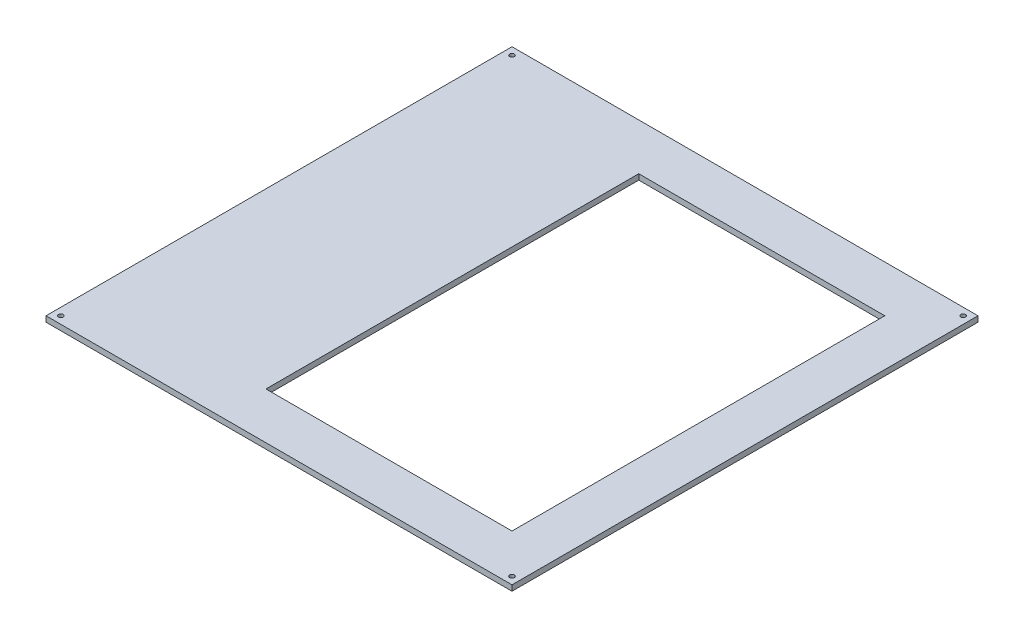
ISO-10303-21;
HEADER;
FILE_DESCRIPTION(('STEP AP214'),'2;1');
FILE_NAME('part.step','',(''),(''),'','','');
FILE_SCHEMA(('AUTOMOTIVE_DESIGN { 1 0 10303 214 1 1 1 1 }'));
ENDSEC;
DATA;
#1=APPLICATION_CONTEXT('core data for automotive mechanical design processes');
#2=APPLICATION_PROTOCOL_DEFINITION('international standard','automotive_design',2000,#1);
#3=PRODUCT_CONTEXT('',#1,'mechanical');
#4=PRODUCT('Part','Part','',(#3));
#5=PRODUCT_RELATED_PRODUCT_CATEGORY('part','',(#4));
#6=PRODUCT_DEFINITION_FORMATION('','',#4);
#7=PRODUCT_DEFINITION_CONTEXT('part definition',#1,'design');
#8=PRODUCT_DEFINITION('design','',#6,#7);
#9=PRODUCT_DEFINITION_SHAPE('','',#8);
#10=(LENGTH_UNIT() NAMED_UNIT(*) SI_UNIT(.MILLI.,.METRE.));
#11=(NAMED_UNIT(*) PLANE_ANGLE_UNIT() SI_UNIT($,.RADIAN.));
#12=(NAMED_UNIT(*) SI_UNIT($,.STERADIAN.) SOLID_ANGLE_UNIT());
#13=UNCERTAINTY_MEASURE_WITH_UNIT(LENGTH_MEASURE(1.E-05),#10,'distance_accuracy_value','');
#14=(GEOMETRIC_REPRESENTATION_CONTEXT(3) GLOBAL_UNCERTAINTY_ASSIGNED_CONTEXT((#13)) GLOBAL_UNIT_ASSIGNED_CONTEXT((#10,
#11,#12)) REPRESENTATION_CONTEXT('',''));
#15=CARTESIAN_POINT('',(0.,0.,0.));
#16=DIRECTION('',(0.,0.,1.));
#17=DIRECTION('',(1.,0.,0.));
#18=AXIS2_PLACEMENT_3D('',#15,#16,#17);
#19=CARTESIAN_POINT('',(125.,3.,125.));
#20=DIRECTION('',(-1.,0.,0.));
#21=DIRECTION('',(0.,0.,1.));
#22=AXIS2_PLACEMENT_3D('',#19,#20,#21);
#23=PLANE('',#22);
#24=DIRECTION('',(0.,0.,-1.));
#25=VECTOR('',#24,1.);
#26=CARTESIAN_POINT('',(125.,0.,125.));
#27=LINE('',#26,#25);
#28=CARTESIAN_POINT('',(125.,0.,125.));
#29=VERTEX_POINT('',#28);
#30=CARTESIAN_POINT('',(125.,0.,-125.));
#31=VERTEX_POINT('',#30);
#32=EDGE_CURVE('E145',#29,#31,#27,.T.);
#33=ORIENTED_EDGE('',*,*,#32,.T.);
#34=DIRECTION('',(0.,-1.,0.));
#35=VECTOR('',#34,1.);
#36=CARTESIAN_POINT('',(125.,3.,-125.));
#37=LINE('',#36,#35);
#38=CARTESIAN_POINT('',(125.,3.,-125.));
#39=VERTEX_POINT('',#38);
#40=EDGE_CURVE('E11',#39,#31,#37,.T.);
#41=ORIENTED_EDGE('',*,*,#40,.F.);
#42=DIRECTION('',(0.,0.,-1.));
#43=VECTOR('',#42,1.);
#44=CARTESIAN_POINT('',(125.,3.,125.));
#45=LINE('',#44,#43);
#46=CARTESIAN_POINT('',(125.,3.,125.));
#47=VERTEX_POINT('',#46);
#48=EDGE_CURVE('E141',#47,#39,#45,.T.);
#49=ORIENTED_EDGE('',*,*,#48,.F.);
#50=DIRECTION('',(0.,-1.,0.));
#51=VECTOR('',#50,1.);
#52=CARTESIAN_POINT('',(125.,3.,125.));
#53=LINE('',#52,#51);
#54=EDGE_CURVE('E155',#47,#29,#53,.T.);
#55=ORIENTED_EDGE('',*,*,#54,.T.);
#56=EDGE_LOOP('',(#33,#41,#49,#55));
#57=FACE_BOUND('',#56,.T.);
#58=ADVANCED_FACE('F41',(#57),#23,.F.);
#59=CARTESIAN_POINT('',(-125.,3.,-125.));
#60=DIRECTION('',(0.,0.,1.));
#61=DIRECTION('',(1.,0.,0.));
#62=AXIS2_PLACEMENT_3D('',#59,#60,#61);
#63=PLANE('',#62);
#64=DIRECTION('',(-1.,0.,0.));
#65=VECTOR('',#64,1.);
#66=CARTESIAN_POINT('',(-125.,0.,-125.));
#67=LINE('',#66,#65);
#68=CARTESIAN_POINT('',(-125.,0.,-125.));
#69=VERTEX_POINT('',#68);
#70=EDGE_CURVE('E156',#31,#69,#67,.T.);
#71=ORIENTED_EDGE('',*,*,#70,.T.);
#72=DIRECTION('',(0.,-1.,0.));
#73=VECTOR('',#72,1.);
#74=CARTESIAN_POINT('',(-125.,3.,-125.));
#75=LINE('',#74,#73);
#76=CARTESIAN_POINT('',(-125.,3.,-125.));
#77=VERTEX_POINT('',#76);
#78=EDGE_CURVE('E48',#77,#69,#75,.T.);
#79=ORIENTED_EDGE('',*,*,#78,.F.);
#80=DIRECTION('',(-1.,0.,0.));
#81=VECTOR('',#80,1.);
#82=CARTESIAN_POINT('',(-125.,3.,-125.));
#83=LINE('',#82,#81);
#84=EDGE_CURVE('E147',#39,#77,#83,.T.);
#85=ORIENTED_EDGE('',*,*,#84,.F.);
#86=ORIENTED_EDGE('',*,*,#40,.T.);
#87=EDGE_LOOP('',(#71,#79,#85,#86));
#88=FACE_BOUND('',#87,.T.);
#89=ADVANCED_FACE('F183',(#88),#63,.F.);
#90=CARTESIAN_POINT('',(-125.,3.,125.));
#91=DIRECTION('',(1.,0.,0.));
#92=DIRECTION('',(0.,0.,-1.));
#93=AXIS2_PLACEMENT_3D('',#90,#91,#92);
#94=PLANE('',#93);
#95=DIRECTION('',(0.,0.,1.));
#96=VECTOR('',#95,1.);
#97=CARTESIAN_POINT('',(-125.,0.,125.));
#98=LINE('',#97,#96);
#99=CARTESIAN_POINT('',(-125.,0.,125.));
#100=VERTEX_POINT('',#99);
#101=EDGE_CURVE('E158',#69,#100,#98,.T.);
#102=ORIENTED_EDGE('',*,*,#101,.T.);
#103=DIRECTION('',(0.,-1.,0.));
#104=VECTOR('',#103,1.);
#105=CARTESIAN_POINT('',(-125.,3.,125.));
#106=LINE('',#105,#104);
#107=CARTESIAN_POINT('',(-125.,3.,125.));
#108=VERTEX_POINT('',#107);
#109=EDGE_CURVE('E161',#108,#100,#106,.T.);
#110=ORIENTED_EDGE('',*,*,#109,.F.);
#111=DIRECTION('',(0.,0.,1.));
#112=VECTOR('',#111,1.);
#113=CARTESIAN_POINT('',(-125.,3.,125.));
#114=LINE('',#113,#112);
#115=EDGE_CURVE('E146',#77,#108,#114,.T.);
#116=ORIENTED_EDGE('',*,*,#115,.F.);
#117=ORIENTED_EDGE('',*,*,#78,.T.);
#118=EDGE_LOOP('',(#102,#110,#116,#117));
#119=FACE_BOUND('',#118,.T.);
#120=ADVANCED_FACE('F167',(#119),#94,.F.);
#121=CARTESIAN_POINT('',(-125.,3.,125.));
#122=DIRECTION('',(0.,0.,-1.));
#123=DIRECTION('',(-1.,0.,0.));
#124=AXIS2_PLACEMENT_3D('',#121,#122,#123);
#125=PLANE('',#124);
#126=DIRECTION('',(1.,0.,0.));
#127=VECTOR('',#126,1.);
#128=CARTESIAN_POINT('',(-125.,0.,125.));
#129=LINE('',#128,#127);
#130=EDGE_CURVE('E150',#100,#29,#129,.T.);
#131=ORIENTED_EDGE('',*,*,#130,.T.);
#132=ORIENTED_EDGE('',*,*,#54,.F.);
#133=DIRECTION('',(1.,0.,0.));
#134=VECTOR('',#133,1.);
#135=CARTESIAN_POINT('',(-125.,3.,125.));
#136=LINE('',#135,#134);
#137=EDGE_CURVE('E152',#108,#47,#136,.T.);
#138=ORIENTED_EDGE('',*,*,#137,.F.);
#139=ORIENTED_EDGE('',*,*,#109,.T.);
#140=EDGE_LOOP('',(#131,#132,#138,#139));
#141=FACE_BOUND('',#140,.T.);
#142=ADVANCED_FACE('F180',(#141),#125,.F.);
#143=CARTESIAN_POINT('',(0.,3.,0.));
#144=DIRECTION('',(0.,-1.,0.));
#145=DIRECTION('',(0.,0.,-1.));
#146=AXIS2_PLACEMENT_3D('',#143,#144,#145);
#147=PLANE('',#146);
#148=CARTESIAN_POINT('',(-121.,3.,-121.));
#149=DIRECTION('',(0.,-1.,0.));
#150=DIRECTION('',(0.,0.,-1.));
#151=AXIS2_PLACEMENT_3D('',#148,#149,#150);
#152=CIRCLE('',#151,1.25);
#153=CARTESIAN_POINT('',(-121.,3.,-122.25));
#154=VERTEX_POINT('',#153);
#155=EDGE_CURVE('E239',#154,#154,#152,.T.);
#156=ORIENTED_EDGE('',*,*,#155,.T.);
#157=EDGE_LOOP('',(#156));
#158=FACE_BOUND('',#157,.T.);
#159=CARTESIAN_POINT('',(121.,3.,-121.));
#160=DIRECTION('',(0.,-1.,0.));
#161=DIRECTION('',(0.,0.,-1.));
#162=AXIS2_PLACEMENT_3D('',#159,#160,#161);
#163=CIRCLE('',#162,1.25);
#164=CARTESIAN_POINT('',(121.,3.,-122.25));
#165=VERTEX_POINT('',#164);
#166=EDGE_CURVE('E236',#165,#165,#163,.T.);
#167=ORIENTED_EDGE('',*,*,#166,.T.);
#168=EDGE_LOOP('',(#167));
#169=FACE_BOUND('',#168,.T.);
#170=CARTESIAN_POINT('',(121.,3.,121.));
#171=DIRECTION('',(0.,-1.,0.));
#172=DIRECTION('',(0.,0.,-1.));
#173=AXIS2_PLACEMENT_3D('',#170,#171,#172);
#174=CIRCLE('',#173,1.25);
#175=CARTESIAN_POINT('',(121.,3.,119.75));
#176=VERTEX_POINT('',#175);
#177=EDGE_CURVE('E234',#176,#176,#174,.T.);
#178=ORIENTED_EDGE('',*,*,#177,.T.);
#179=EDGE_LOOP('',(#178));
#180=FACE_BOUND('',#179,.T.);
#181=CARTESIAN_POINT('',(-121.,3.,121.));
#182=DIRECTION('',(0.,-1.,0.));
#183=DIRECTION('',(0.,0.,-1.));
#184=AXIS2_PLACEMENT_3D('',#181,#182,#183);
#185=CIRCLE('',#184,1.25);
#186=CARTESIAN_POINT('',(-121.,3.,119.75));
#187=VERTEX_POINT('',#186);
#188=EDGE_CURVE('E240',#187,#187,#185,.T.);
#189=ORIENTED_EDGE('',*,*,#188,.T.);
#190=EDGE_LOOP('',(#189));
#191=FACE_BOUND('',#190,.T.);
#192=DIRECTION('',(1.,0.,0.));
#193=VECTOR('',#192,1.);
#194=CARTESIAN_POINT('',(0.,3.,-100.));
#195=LINE('',#194,#193);
#196=CARTESIAN_POINT('',(-32.,3.,-100.));
#197=VERTEX_POINT('',#196);
#198=CARTESIAN_POINT('',(100.,3.,-100.));
#199=VERTEX_POINT('',#198);
#200=EDGE_CURVE('E136',#197,#199,#195,.T.);
#201=ORIENTED_EDGE('',*,*,#200,.T.);
#202=DIRECTION('',(0.,0.,1.));
#203=VECTOR('',#202,1.);
#204=CARTESIAN_POINT('',(100.,3.,0.));
#205=LINE('',#204,#203);
#206=CARTESIAN_POINT('',(100.,3.,100.));
#207=VERTEX_POINT('',#206);
#208=EDGE_CURVE('E137',#199,#207,#205,.T.);
#209=ORIENTED_EDGE('',*,*,#208,.T.);
#210=DIRECTION('',(-1.,0.,0.));
#211=VECTOR('',#210,1.);
#212=CARTESIAN_POINT('',(0.,3.,100.));
#213=LINE('',#212,#211);
#214=CARTESIAN_POINT('',(-32.,3.,100.));
#215=VERTEX_POINT('',#214);
#216=EDGE_CURVE('E132',#207,#215,#213,.T.);
#217=ORIENTED_EDGE('',*,*,#216,.T.);
#218=DIRECTION('',(0.,0.,-1.));
#219=VECTOR('',#218,1.);
#220=CARTESIAN_POINT('',(-32.,3.,0.));
#221=LINE('',#220,#219);
#222=EDGE_CURVE('E111',#215,#197,#221,.T.);
#223=ORIENTED_EDGE('',*,*,#222,.T.);
#224=EDGE_LOOP('',(#201,#209,#217,#223));
#225=FACE_BOUND('',#224,.T.);
#226=ORIENTED_EDGE('',*,*,#48,.T.);
#227=ORIENTED_EDGE('',*,*,#84,.T.);
#228=ORIENTED_EDGE('',*,*,#115,.T.);
#229=ORIENTED_EDGE('',*,*,#137,.T.);
#230=EDGE_LOOP('',(#226,#227,#228,#229));
#231=FACE_BOUND('',#230,.T.);
#232=ADVANCED_FACE('F182',(#158,#169,#180,#191,#225,#231),#147,.F.);
#233=CARTESIAN_POINT('',(0.,0.,0.));
#234=DIRECTION('',(0.,-1.,0.));
#235=DIRECTION('',(0.,0.,-1.));
#236=AXIS2_PLACEMENT_3D('',#233,#234,#235);
#237=PLANE('',#236);
#238=CARTESIAN_POINT('',(-121.,0.,-121.));
#239=DIRECTION('',(0.,-1.,0.));
#240=DIRECTION('',(0.,0.,-1.));
#241=AXIS2_PLACEMENT_3D('',#238,#239,#240);
#242=CIRCLE('',#241,1.25);
#243=CARTESIAN_POINT('',(-121.,0.,-122.25));
#244=VERTEX_POINT('',#243);
#245=EDGE_CURVE('E258',#244,#244,#242,.T.);
#246=ORIENTED_EDGE('',*,*,#245,.F.);
#247=EDGE_LOOP('',(#246));
#248=FACE_BOUND('',#247,.T.);
#249=CARTESIAN_POINT('',(121.,0.,-121.));
#250=DIRECTION('',(0.,-1.,0.));
#251=DIRECTION('',(0.,0.,-1.));
#252=AXIS2_PLACEMENT_3D('',#249,#250,#251);
#253=CIRCLE('',#252,1.25);
#254=CARTESIAN_POINT('',(121.,0.,-122.25));
#255=VERTEX_POINT('',#254);
#256=EDGE_CURVE('E265',#255,#255,#253,.T.);
#257=ORIENTED_EDGE('',*,*,#256,.F.);
#258=EDGE_LOOP('',(#257));
#259=FACE_BOUND('',#258,.T.);
#260=CARTESIAN_POINT('',(121.,0.,121.));
#261=DIRECTION('',(0.,-1.,0.));
#262=DIRECTION('',(0.,0.,-1.));
#263=AXIS2_PLACEMENT_3D('',#260,#261,#262);
#264=CIRCLE('',#263,1.25);
#265=CARTESIAN_POINT('',(121.,0.,119.75));
#266=VERTEX_POINT('',#265);
#267=EDGE_CURVE('E233',#266,#266,#264,.T.);
#268=ORIENTED_EDGE('',*,*,#267,.F.);
#269=EDGE_LOOP('',(#268));
#270=FACE_BOUND('',#269,.T.);
#271=CARTESIAN_POINT('',(-121.,0.,121.));
#272=DIRECTION('',(0.,-1.,0.));
#273=DIRECTION('',(0.,0.,-1.));
#274=AXIS2_PLACEMENT_3D('',#271,#272,#273);
#275=CIRCLE('',#274,1.25);
#276=CARTESIAN_POINT('',(-121.,0.,119.75));
#277=VERTEX_POINT('',#276);
#278=EDGE_CURVE('E243',#277,#277,#275,.T.);
#279=ORIENTED_EDGE('',*,*,#278,.F.);
#280=EDGE_LOOP('',(#279));
#281=FACE_BOUND('',#280,.T.);
#282=DIRECTION('',(0.,0.,1.));
#283=VECTOR('',#282,1.);
#284=CARTESIAN_POINT('',(100.,0.,100.));
#285=LINE('',#284,#283);
#286=CARTESIAN_POINT('',(100.,0.,-100.));
#287=VERTEX_POINT('',#286);
#288=CARTESIAN_POINT('',(100.,0.,100.));
#289=VERTEX_POINT('',#288);
#290=EDGE_CURVE('E64',#287,#289,#285,.T.);
#291=ORIENTED_EDGE('',*,*,#290,.F.);
#292=DIRECTION('',(1.,0.,0.));
#293=VECTOR('',#292,1.);
#294=CARTESIAN_POINT('',(-32.,0.,-100.));
#295=LINE('',#294,#293);
#296=CARTESIAN_POINT('',(-32.,0.,-100.));
#297=VERTEX_POINT('',#296);
#298=EDGE_CURVE('E121',#297,#287,#295,.T.);
#299=ORIENTED_EDGE('',*,*,#298,.F.);
#300=DIRECTION('',(0.,0.,-1.));
#301=VECTOR('',#300,1.);
#302=CARTESIAN_POINT('',(-32.,0.,100.));
#303=LINE('',#302,#301);
#304=CARTESIAN_POINT('',(-32.,0.,100.));
#305=VERTEX_POINT('',#304);
#306=EDGE_CURVE('E108',#305,#297,#303,.T.);
#307=ORIENTED_EDGE('',*,*,#306,.F.);
#308=DIRECTION('',(-1.,0.,0.));
#309=VECTOR('',#308,1.);
#310=CARTESIAN_POINT('',(-32.,0.,100.));
#311=LINE('',#310,#309);
#312=EDGE_CURVE('E120',#289,#305,#311,.T.);
#313=ORIENTED_EDGE('',*,*,#312,.F.);
#314=EDGE_LOOP('',(#291,#299,#307,#313));
#315=FACE_BOUND('',#314,.T.);
#316=ORIENTED_EDGE('',*,*,#32,.F.);
#317=ORIENTED_EDGE('',*,*,#130,.F.);
#318=ORIENTED_EDGE('',*,*,#101,.F.);
#319=ORIENTED_EDGE('',*,*,#70,.F.);
#320=EDGE_LOOP('',(#316,#317,#318,#319));
#321=FACE_BOUND('',#320,.T.);
#322=ADVANCED_FACE('F122',(#248,#259,#270,#281,#315,#321),#237,.T.);
#323=CARTESIAN_POINT('',(100.,10.,100.));
#324=DIRECTION('',(1.,0.,0.));
#325=DIRECTION('',(0.,0.,-1.));
#326=AXIS2_PLACEMENT_3D('',#323,#324,#325);
#327=PLANE('',#326);
#328=DIRECTION('',(0.,-1.,0.));
#329=VECTOR('',#328,1.);
#330=CARTESIAN_POINT('',(100.,10.,-100.));
#331=LINE('',#330,#329);
#332=EDGE_CURVE('E126',#199,#287,#331,.T.);
#333=ORIENTED_EDGE('',*,*,#332,.T.);
#334=ORIENTED_EDGE('',*,*,#290,.T.);
#335=DIRECTION('',(0.,-1.,0.));
#336=VECTOR('',#335,1.);
#337=CARTESIAN_POINT('',(100.,10.,100.));
#338=LINE('',#337,#336);
#339=EDGE_CURVE('E112',#207,#289,#338,.T.);
#340=ORIENTED_EDGE('',*,*,#339,.F.);
#341=ORIENTED_EDGE('',*,*,#208,.F.);
#342=EDGE_LOOP('',(#333,#334,#340,#341));
#343=FACE_BOUND('',#342,.T.);
#344=ADVANCED_FACE('F197',(#343),#327,.F.);
#345=CARTESIAN_POINT('',(-32.,10.,-100.));
#346=DIRECTION('',(0.,0.,-1.));
#347=DIRECTION('',(-1.,0.,0.));
#348=AXIS2_PLACEMENT_3D('',#345,#346,#347);
#349=PLANE('',#348);
#350=DIRECTION('',(0.,-1.,0.));
#351=VECTOR('',#350,1.);
#352=CARTESIAN_POINT('',(-32.,10.,-100.));
#353=LINE('',#352,#351);
#354=EDGE_CURVE('E113',#197,#297,#353,.T.);
#355=ORIENTED_EDGE('',*,*,#354,.T.);
#356=ORIENTED_EDGE('',*,*,#298,.T.);
#357=ORIENTED_EDGE('',*,*,#332,.F.);
#358=ORIENTED_EDGE('',*,*,#200,.F.);
#359=EDGE_LOOP('',(#355,#356,#357,#358));
#360=FACE_BOUND('',#359,.T.);
#361=ADVANCED_FACE('F203',(#360),#349,.F.);
#362=CARTESIAN_POINT('',(-32.,10.,100.));
#363=DIRECTION('',(-1.,0.,0.));
#364=DIRECTION('',(0.,0.,1.));
#365=AXIS2_PLACEMENT_3D('',#362,#363,#364);
#366=PLANE('',#365);
#367=DIRECTION('',(0.,-1.,0.));
#368=VECTOR('',#367,1.);
#369=CARTESIAN_POINT('',(-32.,10.,100.));
#370=LINE('',#369,#368);
#371=EDGE_CURVE('E54',#215,#305,#370,.T.);
#372=ORIENTED_EDGE('',*,*,#371,.T.);
#373=ORIENTED_EDGE('',*,*,#306,.T.);
#374=ORIENTED_EDGE('',*,*,#354,.F.);
#375=ORIENTED_EDGE('',*,*,#222,.F.);
#376=EDGE_LOOP('',(#372,#373,#374,#375));
#377=FACE_BOUND('',#376,.T.);
#378=ADVANCED_FACE('F102',(#377),#366,.F.);
#379=CARTESIAN_POINT('',(-32.,10.,100.));
#380=DIRECTION('',(0.,0.,1.));
#381=DIRECTION('',(1.,0.,0.));
#382=AXIS2_PLACEMENT_3D('',#379,#380,#381);
#383=PLANE('',#382);
#384=ORIENTED_EDGE('',*,*,#339,.T.);
#385=ORIENTED_EDGE('',*,*,#312,.T.);
#386=ORIENTED_EDGE('',*,*,#371,.F.);
#387=ORIENTED_EDGE('',*,*,#216,.F.);
#388=EDGE_LOOP('',(#384,#385,#386,#387));
#389=FACE_BOUND('',#388,.T.);
#390=ADVANCED_FACE('F117',(#389),#383,.F.);
#391=CARTESIAN_POINT('',(-121.,10.,121.));
#392=DIRECTION('',(0.,-1.,0.));
#393=DIRECTION('',(0.,0.,-1.));
#394=AXIS2_PLACEMENT_3D('',#391,#392,#393);
#395=CYLINDRICAL_SURFACE('',#394,1.25);
#396=ORIENTED_EDGE('',*,*,#278,.T.);
#397=EDGE_LOOP('',(#396));
#398=FACE_BOUND('',#397,.T.);
#399=ORIENTED_EDGE('',*,*,#188,.F.);
#400=EDGE_LOOP('',(#399));
#401=FACE_BOUND('',#400,.T.);
#402=ADVANCED_FACE('F207',(#398,#401),#395,.F.);
#403=CARTESIAN_POINT('',(121.,10.,121.));
#404=DIRECTION('',(0.,-1.,0.));
#405=DIRECTION('',(0.,0.,-1.));
#406=AXIS2_PLACEMENT_3D('',#403,#404,#405);
#407=CYLINDRICAL_SURFACE('',#406,1.25);
#408=ORIENTED_EDGE('',*,*,#267,.T.);
#409=EDGE_LOOP('',(#408));
#410=FACE_BOUND('',#409,.T.);
#411=ORIENTED_EDGE('',*,*,#177,.F.);
#412=EDGE_LOOP('',(#411));
#413=FACE_BOUND('',#412,.T.);
#414=ADVANCED_FACE('F211',(#410,#413),#407,.F.);
#415=CARTESIAN_POINT('',(121.,10.,-121.));
#416=DIRECTION('',(0.,-1.,0.));
#417=DIRECTION('',(0.,0.,-1.));
#418=AXIS2_PLACEMENT_3D('',#415,#416,#417);
#419=CYLINDRICAL_SURFACE('',#418,1.25);
#420=ORIENTED_EDGE('',*,*,#256,.T.);
#421=EDGE_LOOP('',(#420));
#422=FACE_BOUND('',#421,.T.);
#423=ORIENTED_EDGE('',*,*,#166,.F.);
#424=EDGE_LOOP('',(#423));
#425=FACE_BOUND('',#424,.T.);
#426=ADVANCED_FACE('F216',(#422,#425),#419,.F.);
#427=CARTESIAN_POINT('',(-121.,10.,-121.));
#428=DIRECTION('',(0.,-1.,0.));
#429=DIRECTION('',(0.,0.,-1.));
#430=AXIS2_PLACEMENT_3D('',#427,#428,#429);
#431=CYLINDRICAL_SURFACE('',#430,1.25);
#432=ORIENTED_EDGE('',*,*,#245,.T.);
#433=EDGE_LOOP('',(#432));
#434=FACE_BOUND('',#433,.T.);
#435=ORIENTED_EDGE('',*,*,#155,.F.);
#436=EDGE_LOOP('',(#435));
#437=FACE_BOUND('',#436,.T.);
#438=ADVANCED_FACE('F217',(#434,#437),#431,.F.);
#439=CLOSED_SHELL('',(#58,#89,#120,#142,#232,#322,#344,#361,#378,#390,#402,#414,#426,#438));
#440=MANIFOLD_SOLID_BREP('B2',#439);
#441=ADVANCED_BREP_SHAPE_REPRESENTATION('',(#18,#440),#14);
#442=SHAPE_DEFINITION_REPRESENTATION(#9,#441);
ENDSEC;
END-ISO-10303-21;
